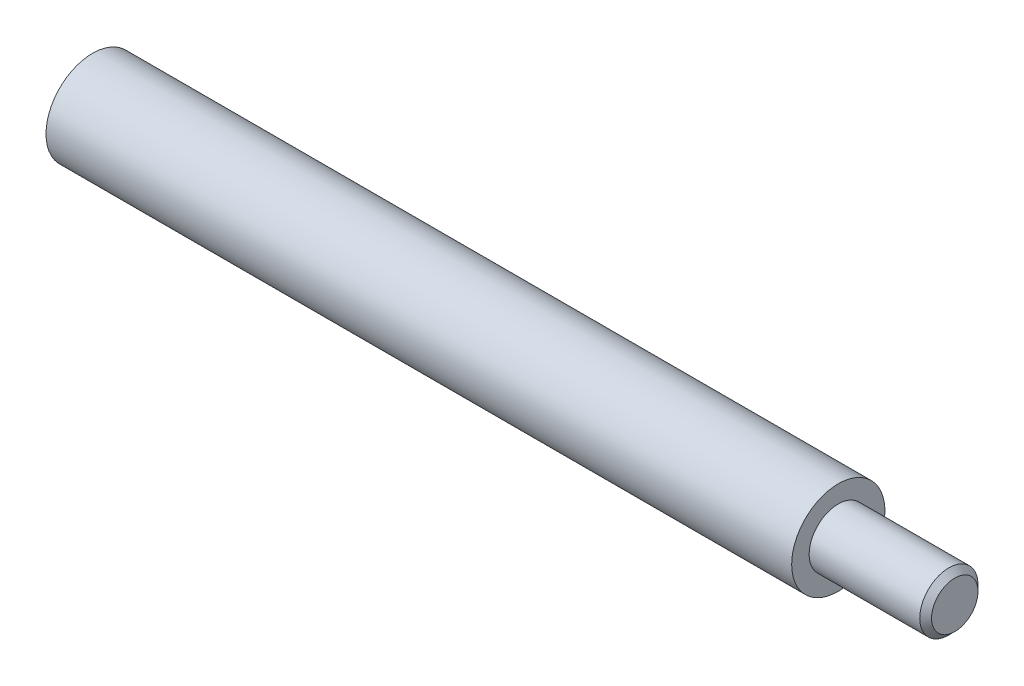
ISO-10303-21;
HEADER;
FILE_DESCRIPTION(('STEP AP214'),'2;1');
FILE_NAME('part.step','',(''),(''),'','','');
FILE_SCHEMA(('AUTOMOTIVE_DESIGN { 1 0 10303 214 1 1 1 1 }'));
ENDSEC;
DATA;
#1=APPLICATION_CONTEXT('core data for automotive mechanical design processes');
#2=APPLICATION_PROTOCOL_DEFINITION('international standard','automotive_design',2000,#1);
#3=PRODUCT_CONTEXT('',#1,'mechanical');
#4=PRODUCT('Part','Part','',(#3));
#5=PRODUCT_RELATED_PRODUCT_CATEGORY('part','',(#4));
#6=PRODUCT_DEFINITION_FORMATION('','',#4);
#7=PRODUCT_DEFINITION_CONTEXT('part definition',#1,'design');
#8=PRODUCT_DEFINITION('design','',#6,#7);
#9=PRODUCT_DEFINITION_SHAPE('','',#8);
#10=(LENGTH_UNIT() NAMED_UNIT(*) SI_UNIT(.MILLI.,.METRE.));
#11=(NAMED_UNIT(*) PLANE_ANGLE_UNIT() SI_UNIT($,.RADIAN.));
#12=(NAMED_UNIT(*) SI_UNIT($,.STERADIAN.) SOLID_ANGLE_UNIT());
#13=UNCERTAINTY_MEASURE_WITH_UNIT(LENGTH_MEASURE(1.E-05),#10,'distance_accuracy_value','');
#14=(GEOMETRIC_REPRESENTATION_CONTEXT(3) GLOBAL_UNCERTAINTY_ASSIGNED_CONTEXT((#13)) GLOBAL_UNIT_ASSIGNED_CONTEXT((#10,
#11,#12)) REPRESENTATION_CONTEXT('',''));
#15=CARTESIAN_POINT('',(0.,0.,0.));
#16=DIRECTION('',(0.,0.,1.));
#17=DIRECTION('',(1.,0.,0.));
#18=AXIS2_PLACEMENT_3D('',#15,#16,#17);
#19=CARTESIAN_POINT('',(-16.,0.,0.));
#20=DIRECTION('',(1.,0.,0.));
#21=DIRECTION('',(0.,0.,-1.));
#22=AXIS2_PLACEMENT_3D('',#19,#20,#21);
#23=PLANE('',#22);
#24=CARTESIAN_POINT('',(-16.,0.,0.));
#25=DIRECTION('',(-1.,0.,0.));
#26=DIRECTION('',(0.,0.,1.));
#27=AXIS2_PLACEMENT_3D('',#24,#25,#26);
#28=CIRCLE('',#27,1.24999999999999);
#29=CARTESIAN_POINT('',(-16.,0.,1.24999999999999));
#30=VERTEX_POINT('',#29);
#31=EDGE_CURVE('E75',#30,#30,#28,.T.);
#32=ORIENTED_EDGE('',*,*,#31,.F.);
#33=EDGE_LOOP('',(#32));
#34=FACE_BOUND('',#33,.T.);
#35=CARTESIAN_POINT('',(-16.,0.,0.));
#36=DIRECTION('',(-1.,0.,0.));
#37=DIRECTION('',(0.,0.,1.));
#38=AXIS2_PLACEMENT_3D('',#35,#36,#37);
#39=CIRCLE('',#38,1.99999999999999);
#40=CARTESIAN_POINT('',(-16.,0.,1.99999999999999));
#41=VERTEX_POINT('',#40);
#42=EDGE_CURVE('E62',#41,#41,#39,.T.);
#43=ORIENTED_EDGE('',*,*,#42,.T.);
#44=EDGE_LOOP('',(#43));
#45=FACE_BOUND('',#44,.T.);
#46=ADVANCED_FACE('F55',(#34,#45),#23,.F.);
#47=CARTESIAN_POINT('',(16.,1.25,0.));
#48=DIRECTION('',(-1.,0.,0.));
#49=DIRECTION('',(0.,0.,1.));
#50=AXIS2_PLACEMENT_3D('',#47,#48,#49);
#51=PLANE('',#50);
#52=CARTESIAN_POINT('',(16.,0.,0.));
#53=DIRECTION('',(-1.,0.,0.));
#54=DIRECTION('',(0.,0.,1.));
#55=AXIS2_PLACEMENT_3D('',#52,#53,#54);
#56=CIRCLE('',#55,1.25);
#57=CARTESIAN_POINT('',(16.,0.,1.25));
#58=VERTEX_POINT('',#57);
#59=EDGE_CURVE('E87',#58,#58,#56,.T.);
#60=ORIENTED_EDGE('',*,*,#59,.T.);
#61=EDGE_LOOP('',(#60));
#62=FACE_BOUND('',#61,.T.);
#63=CARTESIAN_POINT('',(16.,0.,0.));
#64=DIRECTION('',(-1.,0.,0.));
#65=DIRECTION('',(0.,0.,1.));
#66=AXIS2_PLACEMENT_3D('',#63,#64,#65);
#67=CIRCLE('',#66,1.99999999999999);
#68=CARTESIAN_POINT('',(16.,0.,1.99999999999999));
#69=VERTEX_POINT('',#68);
#70=EDGE_CURVE('E11',#69,#69,#67,.T.);
#71=ORIENTED_EDGE('',*,*,#70,.F.);
#72=EDGE_LOOP('',(#71));
#73=FACE_BOUND('',#72,.T.);
#74=ADVANCED_FACE('F91',(#62,#73),#51,.F.);
#75=CARTESIAN_POINT('',(0.,0.,0.));
#76=DIRECTION('',(-1.,0.,0.));
#77=DIRECTION('',(0.,0.,1.));
#78=AXIS2_PLACEMENT_3D('',#75,#76,#77);
#79=CYLINDRICAL_SURFACE('',#78,1.99999999999999);
#80=ORIENTED_EDGE('',*,*,#42,.F.);
#81=EDGE_LOOP('',(#80));
#82=FACE_BOUND('',#81,.T.);
#83=ORIENTED_EDGE('',*,*,#70,.T.);
#84=EDGE_LOOP('',(#83));
#85=FACE_BOUND('',#84,.T.);
#86=ADVANCED_FACE('F69',(#82,#85),#79,.T.);
#87=CARTESIAN_POINT('',(-9.5,0.,0.));
#88=DIRECTION('',(-1.,0.,0.));
#89=DIRECTION('',(0.,0.,1.));
#90=AXIS2_PLACEMENT_3D('',#87,#88,#89);
#91=CONICAL_SURFACE('',#90,1.25,1.02974425867665);
#92=CARTESIAN_POINT('',(-8.74892422621555,0.,0.));
#93=VERTEX_POINT('',#92);
#94=VERTEX_LOOP('',#93);
#95=FACE_BOUND('',#94,.T.);
#96=CARTESIAN_POINT('',(-9.5,0.,0.));
#97=DIRECTION('',(-1.,0.,0.));
#98=DIRECTION('',(0.,0.,1.));
#99=AXIS2_PLACEMENT_3D('',#96,#97,#98);
#100=CIRCLE('',#99,1.25);
#101=CARTESIAN_POINT('',(-9.5,0.,1.25));
#102=VERTEX_POINT('',#101);
#103=EDGE_CURVE('E73',#102,#102,#100,.T.);
#104=ORIENTED_EDGE('',*,*,#103,.T.);
#105=EDGE_LOOP('',(#104));
#106=FACE_BOUND('',#105,.T.);
#107=ADVANCED_FACE('F65',(#95,#106),#91,.F.);
#108=CARTESIAN_POINT('',(-16.,0.,0.));
#109=DIRECTION('',(-1.,0.,0.));
#110=DIRECTION('',(0.,0.,1.));
#111=AXIS2_PLACEMENT_3D('',#108,#109,#110);
#112=CYLINDRICAL_SURFACE('',#111,1.24999999999999);
#113=ORIENTED_EDGE('',*,*,#103,.F.);
#114=EDGE_LOOP('',(#113));
#115=FACE_BOUND('',#114,.T.);
#116=ORIENTED_EDGE('',*,*,#31,.T.);
#117=EDGE_LOOP('',(#116));
#118=FACE_BOUND('',#117,.T.);
#119=ADVANCED_FACE('F68',(#115,#118),#112,.F.);
#120=CARTESIAN_POINT('',(21.,0.9965,0.));
#121=DIRECTION('',(1.,0.,0.));
#122=DIRECTION('',(0.,0.,-1.));
#123=AXIS2_PLACEMENT_3D('',#120,#121,#122);
#124=PLANE('',#123);
#125=CARTESIAN_POINT('',(21.,0.,0.));
#126=DIRECTION('',(-1.,0.,0.));
#127=DIRECTION('',(0.,0.,1.));
#128=AXIS2_PLACEMENT_3D('',#125,#126,#127);
#129=CIRCLE('',#128,0.9965);
#130=CARTESIAN_POINT('',(21.,0.,0.9965));
#131=VERTEX_POINT('',#130);
#132=EDGE_CURVE('E79',#131,#131,#129,.T.);
#133=ORIENTED_EDGE('',*,*,#132,.F.);
#134=EDGE_LOOP('',(#133));
#135=FACE_BOUND('',#134,.T.);
#136=ADVANCED_FACE('F102',(#135),#124,.T.);
#137=CARTESIAN_POINT('',(20.7465,0.,0.));
#138=DIRECTION('',(-1.,0.,0.));
#139=DIRECTION('',(0.,0.,1.));
#140=AXIS2_PLACEMENT_3D('',#137,#138,#139);
#141=CONICAL_SURFACE('',#140,1.25,0.785398163397453);
#142=ORIENTED_EDGE('',*,*,#132,.T.);
#143=EDGE_LOOP('',(#142));
#144=FACE_BOUND('',#143,.T.);
#145=CARTESIAN_POINT('',(20.7465,0.,0.));
#146=DIRECTION('',(-1.,0.,0.));
#147=DIRECTION('',(0.,0.,1.));
#148=AXIS2_PLACEMENT_3D('',#145,#146,#147);
#149=CIRCLE('',#148,1.25);
#150=CARTESIAN_POINT('',(20.7465,0.,1.25));
#151=VERTEX_POINT('',#150);
#152=EDGE_CURVE('E84',#151,#151,#149,.T.);
#153=ORIENTED_EDGE('',*,*,#152,.F.);
#154=EDGE_LOOP('',(#153));
#155=FACE_BOUND('',#154,.T.);
#156=ADVANCED_FACE('F96',(#144,#155),#141,.T.);
#157=CARTESIAN_POINT('',(16.,0.,0.));
#158=DIRECTION('',(-1.,0.,0.));
#159=DIRECTION('',(0.,0.,1.));
#160=AXIS2_PLACEMENT_3D('',#157,#158,#159);
#161=CYLINDRICAL_SURFACE('',#160,1.25);
#162=ORIENTED_EDGE('',*,*,#152,.T.);
#163=EDGE_LOOP('',(#162));
#164=FACE_BOUND('',#163,.T.);
#165=ORIENTED_EDGE('',*,*,#59,.F.);
#166=EDGE_LOOP('',(#165));
#167=FACE_BOUND('',#166,.T.);
#168=ADVANCED_FACE('F94',(#164,#167),#161,.T.);
#169=CLOSED_SHELL('',(#46,#74,#86,#107,#119,#136,#156,#168));
#170=MANIFOLD_SOLID_BREP('B2',#169);
#171=ADVANCED_BREP_SHAPE_REPRESENTATION('',(#18,#170),#14);
#172=SHAPE_DEFINITION_REPRESENTATION(#9,#171);
ENDSEC;
END-ISO-10303-21;
